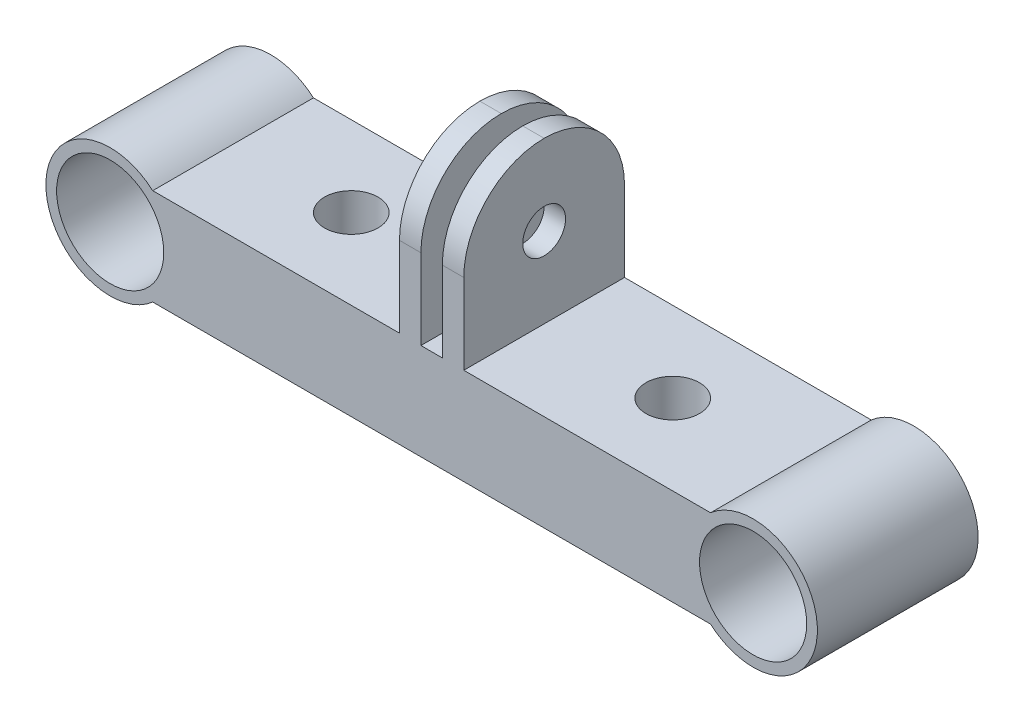
ISO-10303-21;
HEADER;
FILE_DESCRIPTION(('STEP AP214'),'2;1');
FILE_NAME('part.step','',(''),(''),'','','');
FILE_SCHEMA(('AUTOMOTIVE_DESIGN { 1 0 10303 214 1 1 1 1 }'));
ENDSEC;
DATA;
#1=APPLICATION_CONTEXT('core data for automotive mechanical design processes');
#2=APPLICATION_PROTOCOL_DEFINITION('international standard','automotive_design',2000,#1);
#3=PRODUCT_CONTEXT('',#1,'mechanical');
#4=PRODUCT('Part','Part','',(#3));
#5=PRODUCT_RELATED_PRODUCT_CATEGORY('part','',(#4));
#6=PRODUCT_DEFINITION_FORMATION('','',#4);
#7=PRODUCT_DEFINITION_CONTEXT('part definition',#1,'design');
#8=PRODUCT_DEFINITION('design','',#6,#7);
#9=PRODUCT_DEFINITION_SHAPE('','',#8);
#10=(LENGTH_UNIT() NAMED_UNIT(*) SI_UNIT(.MILLI.,.METRE.));
#11=(NAMED_UNIT(*) PLANE_ANGLE_UNIT() SI_UNIT($,.RADIAN.));
#12=(NAMED_UNIT(*) SI_UNIT($,.STERADIAN.) SOLID_ANGLE_UNIT());
#13=UNCERTAINTY_MEASURE_WITH_UNIT(LENGTH_MEASURE(1.E-05),#10,'distance_accuracy_value','');
#14=(GEOMETRIC_REPRESENTATION_CONTEXT(3) GLOBAL_UNCERTAINTY_ASSIGNED_CONTEXT((#13)) GLOBAL_UNIT_ASSIGNED_CONTEXT((#10,
#11,#12)) REPRESENTATION_CONTEXT('',''));
#15=CARTESIAN_POINT('',(0.,0.,0.));
#16=DIRECTION('',(0.,0.,1.));
#17=DIRECTION('',(1.,0.,0.));
#18=AXIS2_PLACEMENT_3D('',#15,#16,#17);
#19=CARTESIAN_POINT('',(-26.0313730334031,-4.5,7.5));
#20=DIRECTION('',(0.,1.,0.));
#21=DIRECTION('',(0.,0.,1.));
#22=AXIS2_PLACEMENT_3D('',#19,#20,#21);
#23=PLANE('',#22);
#24=DIRECTION('',(1.,0.,0.));
#25=VECTOR('',#24,1.);
#26=CARTESIAN_POINT('',(-26.0313730334031,-4.5,-7.5));
#27=LINE('',#26,#25);
#28=CARTESIAN_POINT('',(-26.0313730334031,-4.5,-7.5));
#29=VERTEX_POINT('',#28);
#30=CARTESIAN_POINT('',(26.0313730334031,-4.5,-7.5));
#31=VERTEX_POINT('',#30);
#32=EDGE_CURVE('E223',#29,#31,#27,.T.);
#33=ORIENTED_EDGE('',*,*,#32,.T.);
#34=DIRECTION('',(0.,0.,-1.));
#35=VECTOR('',#34,1.);
#36=CARTESIAN_POINT('',(26.0313730334031,-4.5,7.5));
#37=LINE('',#36,#35);
#38=CARTESIAN_POINT('',(26.0313730334031,-4.5,7.5));
#39=VERTEX_POINT('',#38);
#40=EDGE_CURVE('E235',#39,#31,#37,.T.);
#41=ORIENTED_EDGE('',*,*,#40,.F.);
#42=DIRECTION('',(1.,0.,0.));
#43=VECTOR('',#42,1.);
#44=CARTESIAN_POINT('',(-26.0313730334031,-4.5,7.5));
#45=LINE('',#44,#43);
#46=CARTESIAN_POINT('',(-26.0313730334031,-4.5,7.5));
#47=VERTEX_POINT('',#46);
#48=EDGE_CURVE('E211',#47,#39,#45,.T.);
#49=ORIENTED_EDGE('',*,*,#48,.F.);
#50=DIRECTION('',(0.,0.,-1.));
#51=VECTOR('',#50,1.);
#52=CARTESIAN_POINT('',(-26.0313730334031,-4.5,7.5));
#53=LINE('',#52,#51);
#54=EDGE_CURVE('E238',#47,#29,#53,.T.);
#55=ORIENTED_EDGE('',*,*,#54,.T.);
#56=EDGE_LOOP('',(#33,#41,#49,#55));
#57=FACE_BOUND('',#56,.T.);
#58=CARTESIAN_POINT('',(15.,-4.5,0.));
#59=DIRECTION('',(0.,1.,0.));
#60=DIRECTION('',(0.,0.,1.));
#61=AXIS2_PLACEMENT_3D('',#58,#59,#60);
#62=CIRCLE('',#61,2.5);
#63=CARTESIAN_POINT('',(15.,-4.5,2.5));
#64=VERTEX_POINT('',#63);
#65=EDGE_CURVE('E270',#64,#64,#62,.F.);
#66=ORIENTED_EDGE('',*,*,#65,.F.);
#67=EDGE_LOOP('',(#66));
#68=FACE_BOUND('',#67,.T.);
#69=CARTESIAN_POINT('',(-15.,-4.5,0.));
#70=DIRECTION('',(0.,1.,0.));
#71=DIRECTION('',(0.,0.,1.));
#72=AXIS2_PLACEMENT_3D('',#69,#70,#71);
#73=CIRCLE('',#72,2.5);
#74=CARTESIAN_POINT('',(-15.,-4.5,2.5));
#75=VERTEX_POINT('',#74);
#76=EDGE_CURVE('E41',#75,#75,#73,.T.);
#77=ORIENTED_EDGE('',*,*,#76,.T.);
#78=EDGE_LOOP('',(#77));
#79=FACE_BOUND('',#78,.T.);
#80=ADVANCED_FACE('F37',(#57,#68,#79),#23,.F.);
#81=CARTESIAN_POINT('',(-30.,12.,0.));
#82=DIRECTION('',(-1.,0.,0.));
#83=DIRECTION('',(0.,0.,1.));
#84=AXIS2_PLACEMENT_3D('',#81,#82,#83);
#85=CYLINDRICAL_SURFACE('',#84,7.5);
#86=CARTESIAN_POINT('',(1.,12.,0.));
#87=DIRECTION('',(1.,0.,0.));
#88=DIRECTION('',(0.,0.,-1.));
#89=AXIS2_PLACEMENT_3D('',#86,#87,#88);
#90=CIRCLE('',#89,7.5);
#91=CARTESIAN_POINT('',(1.,12.,7.5));
#92=VERTEX_POINT('',#91);
#93=CARTESIAN_POINT('',(1.,19.5,0.));
#94=VERTEX_POINT('',#93);
#95=EDGE_CURVE('E176',#92,#94,#90,.F.);
#96=ORIENTED_EDGE('',*,*,#95,.F.);
#97=DIRECTION('',(-1.,0.,0.));
#98=VECTOR('',#97,1.);
#99=CARTESIAN_POINT('',(-30.,12.,7.5));
#100=LINE('',#99,#98);
#101=CARTESIAN_POINT('',(3.,12.,7.5));
#102=VERTEX_POINT('',#101);
#103=EDGE_CURVE('E252',#102,#92,#100,.T.);
#104=ORIENTED_EDGE('',*,*,#103,.F.);
#105=CARTESIAN_POINT('',(3.,12.,0.));
#106=DIRECTION('',(1.,0.,0.));
#107=DIRECTION('',(0.,0.,-1.));
#108=AXIS2_PLACEMENT_3D('',#105,#106,#107);
#109=CIRCLE('',#108,7.5);
#110=CARTESIAN_POINT('',(3.,19.5,0.));
#111=VERTEX_POINT('',#110);
#112=EDGE_CURVE('E247',#111,#102,#109,.T.);
#113=ORIENTED_EDGE('',*,*,#112,.F.);
#114=DIRECTION('',(-1.,0.,0.));
#115=VECTOR('',#114,1.);
#116=CARTESIAN_POINT('',(-3.,19.5,0.));
#117=LINE('',#116,#115);
#118=EDGE_CURVE('E62',#94,#111,#117,.F.);
#119=ORIENTED_EDGE('',*,*,#118,.F.);
#120=EDGE_LOOP('',(#96,#104,#113,#119));
#121=FACE_BOUND('',#120,.T.);
#122=ADVANCED_FACE('F336',(#121),#85,.T.);
#123=CARTESIAN_POINT('',(-3.,12.,0.));
#124=DIRECTION('',(1.,0.,0.));
#125=DIRECTION('',(0.,0.,-1.));
#126=AXIS2_PLACEMENT_3D('',#123,#124,#125);
#127=CYLINDRICAL_SURFACE('',#126,7.5);
#128=CARTESIAN_POINT('',(1.,12.,0.));
#129=DIRECTION('',(1.,0.,0.));
#130=DIRECTION('',(0.,0.,-1.));
#131=AXIS2_PLACEMENT_3D('',#128,#129,#130);
#132=CIRCLE('',#131,7.5);
#133=CARTESIAN_POINT('',(1.,12.,-7.5));
#134=VERTEX_POINT('',#133);
#135=EDGE_CURVE('E11',#94,#134,#132,.F.);
#136=ORIENTED_EDGE('',*,*,#135,.F.);
#137=ORIENTED_EDGE('',*,*,#118,.T.);
#138=CARTESIAN_POINT('',(3.,12.,0.));
#139=DIRECTION('',(1.,0.,0.));
#140=DIRECTION('',(0.,0.,-1.));
#141=AXIS2_PLACEMENT_3D('',#138,#139,#140);
#142=CIRCLE('',#141,7.5);
#143=CARTESIAN_POINT('',(3.,12.,-7.5));
#144=VERTEX_POINT('',#143);
#145=EDGE_CURVE('E249',#144,#111,#142,.T.);
#146=ORIENTED_EDGE('',*,*,#145,.F.);
#147=DIRECTION('',(-1.,0.,0.));
#148=VECTOR('',#147,1.);
#149=CARTESIAN_POINT('',(3.,12.,-7.5));
#150=LINE('',#149,#148);
#151=EDGE_CURVE('E245',#134,#144,#150,.F.);
#152=ORIENTED_EDGE('',*,*,#151,.F.);
#153=EDGE_LOOP('',(#136,#137,#146,#152));
#154=FACE_BOUND('',#153,.T.);
#155=ADVANCED_FACE('F341',(#154),#127,.T.);
#156=CARTESIAN_POINT('',(-26.0313730334031,4.5,7.5));
#157=DIRECTION('',(0.,-1.,0.));
#158=DIRECTION('',(0.,0.,-1.));
#159=AXIS2_PLACEMENT_3D('',#156,#157,#158);
#160=PLANE('',#159);
#161=CARTESIAN_POINT('',(-15.,4.5,0.));
#162=DIRECTION('',(0.,1.,0.));
#163=DIRECTION('',(0.,0.,1.));
#164=AXIS2_PLACEMENT_3D('',#161,#162,#163);
#165=CIRCLE('',#164,2.5);
#166=CARTESIAN_POINT('',(-15.,4.5,2.5));
#167=VERTEX_POINT('',#166);
#168=EDGE_CURVE('E380',#167,#167,#165,.T.);
#169=ORIENTED_EDGE('',*,*,#168,.F.);
#170=EDGE_LOOP('',(#169));
#171=FACE_BOUND('',#170,.T.);
#172=DIRECTION('',(-1.,0.,0.));
#173=VECTOR('',#172,1.);
#174=CARTESIAN_POINT('',(-26.0313730334031,4.5,7.5));
#175=LINE('',#174,#173);
#176=CARTESIAN_POINT('',(-3.00000000000001,4.5,7.5));
#177=VERTEX_POINT('',#176);
#178=CARTESIAN_POINT('',(-26.0313730334031,4.5,7.5));
#179=VERTEX_POINT('',#178);
#180=EDGE_CURVE('E216',#177,#179,#175,.T.);
#181=ORIENTED_EDGE('',*,*,#180,.F.);
#182=DIRECTION('',(0.,0.,1.));
#183=VECTOR('',#182,1.);
#184=CARTESIAN_POINT('',(-3.,4.5,-7.5));
#185=LINE('',#184,#183);
#186=CARTESIAN_POINT('',(-3.,4.5,-7.5));
#187=VERTEX_POINT('',#186);
#188=EDGE_CURVE('E190',#187,#177,#185,.T.);
#189=ORIENTED_EDGE('',*,*,#188,.F.);
#190=DIRECTION('',(-1.,0.,0.));
#191=VECTOR('',#190,1.);
#192=CARTESIAN_POINT('',(-26.0313730334031,4.5,-7.5));
#193=LINE('',#192,#191);
#194=CARTESIAN_POINT('',(-26.0313730334031,4.5,-7.5));
#195=VERTEX_POINT('',#194);
#196=EDGE_CURVE('E227',#187,#195,#193,.T.);
#197=ORIENTED_EDGE('',*,*,#196,.T.);
#198=DIRECTION('',(0.,0.,-1.));
#199=VECTOR('',#198,1.);
#200=CARTESIAN_POINT('',(-26.0313730334031,4.5,7.5));
#201=LINE('',#200,#199);
#202=EDGE_CURVE('E220',#179,#195,#201,.T.);
#203=ORIENTED_EDGE('',*,*,#202,.F.);
#204=EDGE_LOOP('',(#181,#189,#197,#203));
#205=FACE_BOUND('',#204,.T.);
#206=ADVANCED_FACE('F308',(#171,#205),#160,.F.);
#207=CARTESIAN_POINT('',(-30.,0.,7.5));
#208=DIRECTION('',(0.,0.,1.));
#209=DIRECTION('',(1.,0.,0.));
#210=AXIS2_PLACEMENT_3D('',#207,#208,#209);
#211=PLANE('',#210);
#212=DIRECTION('',(0.,1.,0.));
#213=VECTOR('',#212,1.);
#214=CARTESIAN_POINT('',(1.,4.5,7.5));
#215=LINE('',#214,#213);
#216=CARTESIAN_POINT('',(1.,4.5,7.5));
#217=VERTEX_POINT('',#216);
#218=EDGE_CURVE('E168',#217,#92,#215,.T.);
#219=ORIENTED_EDGE('',*,*,#218,.F.);
#220=DIRECTION('',(1.,0.,0.));
#221=VECTOR('',#220,1.);
#222=CARTESIAN_POINT('',(1.,4.5,7.5));
#223=LINE('',#222,#221);
#224=CARTESIAN_POINT('',(-1.,4.5,7.5));
#225=VERTEX_POINT('',#224);
#226=EDGE_CURVE('E164',#225,#217,#223,.T.);
#227=ORIENTED_EDGE('',*,*,#226,.F.);
#228=DIRECTION('',(0.,-1.,0.));
#229=VECTOR('',#228,1.);
#230=CARTESIAN_POINT('',(-1.,4.5,7.5));
#231=LINE('',#230,#229);
#232=CARTESIAN_POINT('',(-1.,12.,7.5));
#233=VERTEX_POINT('',#232);
#234=EDGE_CURVE('E143',#233,#225,#231,.T.);
#235=ORIENTED_EDGE('',*,*,#234,.F.);
#236=CARTESIAN_POINT('',(-3.,12.,7.5));
#237=VERTEX_POINT('',#236);
#238=EDGE_CURVE('E251',#233,#237,#100,.T.);
#239=ORIENTED_EDGE('',*,*,#238,.T.);
#240=DIRECTION('',(0.,-1.,0.));
#241=VECTOR('',#240,1.);
#242=CARTESIAN_POINT('',(-3.,4.5,7.5));
#243=LINE('',#242,#241);
#244=EDGE_CURVE('E182',#237,#177,#243,.T.);
#245=ORIENTED_EDGE('',*,*,#244,.T.);
#246=ORIENTED_EDGE('',*,*,#180,.T.);
#247=CARTESIAN_POINT('',(-30.,0.,7.5));
#248=DIRECTION('',(0.,0.,1.));
#249=DIRECTION('',(1.,0.,0.));
#250=AXIS2_PLACEMENT_3D('',#247,#248,#249);
#251=CIRCLE('',#250,6.);
#252=EDGE_CURVE('E208',#179,#47,#251,.T.);
#253=ORIENTED_EDGE('',*,*,#252,.T.);
#254=ORIENTED_EDGE('',*,*,#48,.T.);
#255=CARTESIAN_POINT('',(30.,0.,7.5));
#256=DIRECTION('',(0.,0.,1.));
#257=DIRECTION('',(1.,0.,0.));
#258=AXIS2_PLACEMENT_3D('',#255,#256,#257);
#259=CIRCLE('',#258,6.);
#260=CARTESIAN_POINT('',(26.0313730334031,4.5,7.5));
#261=VERTEX_POINT('',#260);
#262=EDGE_CURVE('E214',#39,#261,#259,.T.);
#263=ORIENTED_EDGE('',*,*,#262,.T.);
#264=CARTESIAN_POINT('',(3.,4.5,7.5));
#265=VERTEX_POINT('',#264);
#266=EDGE_CURVE('E217',#261,#265,#175,.T.);
#267=ORIENTED_EDGE('',*,*,#266,.T.);
#268=DIRECTION('',(0.,1.,0.));
#269=VECTOR('',#268,1.);
#270=CARTESIAN_POINT('',(3.,19.5,7.5));
#271=LINE('',#270,#269);
#272=EDGE_CURVE('E185',#265,#102,#271,.T.);
#273=ORIENTED_EDGE('',*,*,#272,.T.);
#274=ORIENTED_EDGE('',*,*,#103,.T.);
#275=EDGE_LOOP('',(#219,#227,#235,#239,#245,#246,#253,#254,#263,#267,#273,#274));
#276=FACE_BOUND('',#275,.T.);
#277=CARTESIAN_POINT('',(-30.,0.,7.5));
#278=DIRECTION('',(0.,0.,1.));
#279=DIRECTION('',(1.,0.,0.));
#280=AXIS2_PLACEMENT_3D('',#277,#278,#279);
#281=CIRCLE('',#280,5.);
#282=CARTESIAN_POINT('',(-25.,0.,7.5));
#283=VERTEX_POINT('',#282);
#284=EDGE_CURVE('E202',#283,#283,#281,.T.);
#285=ORIENTED_EDGE('',*,*,#284,.F.);
#286=EDGE_LOOP('',(#285));
#287=FACE_BOUND('',#286,.T.);
#288=CARTESIAN_POINT('',(30.,0.,7.5));
#289=DIRECTION('',(0.,0.,1.));
#290=DIRECTION('',(1.,0.,0.));
#291=AXIS2_PLACEMENT_3D('',#288,#289,#290);
#292=CIRCLE('',#291,5.);
#293=CARTESIAN_POINT('',(35.,0.,7.5));
#294=VERTEX_POINT('',#293);
#295=EDGE_CURVE('E196',#294,#294,#292,.T.);
#296=ORIENTED_EDGE('',*,*,#295,.F.);
#297=EDGE_LOOP('',(#296));
#298=FACE_BOUND('',#297,.T.);
#299=ADVANCED_FACE('F322',(#276,#287,#298),#211,.T.);
#300=CARTESIAN_POINT('',(-30.,0.,-7.5));
#301=DIRECTION('',(0.,0.,1.));
#302=DIRECTION('',(1.,0.,0.));
#303=AXIS2_PLACEMENT_3D('',#300,#301,#302);
#304=PLANE('',#303);
#305=DIRECTION('',(1.,0.,0.));
#306=VECTOR('',#305,1.);
#307=CARTESIAN_POINT('',(1.,4.5,-7.5));
#308=LINE('',#307,#306);
#309=CARTESIAN_POINT('',(-1.,4.5,-7.5));
#310=VERTEX_POINT('',#309);
#311=CARTESIAN_POINT('',(1.,4.5,-7.5));
#312=VERTEX_POINT('',#311);
#313=EDGE_CURVE('E148',#310,#312,#308,.T.);
#314=ORIENTED_EDGE('',*,*,#313,.T.);
#315=DIRECTION('',(0.,1.,0.));
#316=VECTOR('',#315,1.);
#317=CARTESIAN_POINT('',(1.,4.5,-7.5));
#318=LINE('',#317,#316);
#319=EDGE_CURVE('E162',#312,#134,#318,.T.);
#320=ORIENTED_EDGE('',*,*,#319,.T.);
#321=ORIENTED_EDGE('',*,*,#151,.T.);
#322=DIRECTION('',(0.,1.,0.));
#323=VECTOR('',#322,1.);
#324=CARTESIAN_POINT('',(3.,19.5,-7.5));
#325=LINE('',#324,#323);
#326=CARTESIAN_POINT('',(3.,4.5,-7.5));
#327=VERTEX_POINT('',#326);
#328=EDGE_CURVE('E178',#327,#144,#325,.T.);
#329=ORIENTED_EDGE('',*,*,#328,.F.);
#330=CARTESIAN_POINT('',(26.0313730334031,4.5,-7.5));
#331=VERTEX_POINT('',#330);
#332=EDGE_CURVE('E212',#331,#327,#193,.T.);
#333=ORIENTED_EDGE('',*,*,#332,.F.);
#334=CARTESIAN_POINT('',(30.,0.,-7.5));
#335=DIRECTION('',(0.,0.,1.));
#336=DIRECTION('',(1.,0.,0.));
#337=AXIS2_PLACEMENT_3D('',#334,#335,#336);
#338=CIRCLE('',#337,6.);
#339=EDGE_CURVE('E225',#31,#331,#338,.T.);
#340=ORIENTED_EDGE('',*,*,#339,.F.);
#341=ORIENTED_EDGE('',*,*,#32,.F.);
#342=CARTESIAN_POINT('',(-30.,0.,-7.5));
#343=DIRECTION('',(0.,0.,1.));
#344=DIRECTION('',(1.,0.,0.));
#345=AXIS2_PLACEMENT_3D('',#342,#343,#344);
#346=CIRCLE('',#345,6.);
#347=EDGE_CURVE('E205',#195,#29,#346,.T.);
#348=ORIENTED_EDGE('',*,*,#347,.F.);
#349=ORIENTED_EDGE('',*,*,#196,.F.);
#350=DIRECTION('',(0.,-1.,0.));
#351=VECTOR('',#350,1.);
#352=CARTESIAN_POINT('',(-3.,4.5,-7.5));
#353=LINE('',#352,#351);
#354=CARTESIAN_POINT('',(-3.,12.,-7.5));
#355=VERTEX_POINT('',#354);
#356=EDGE_CURVE('E181',#355,#187,#353,.T.);
#357=ORIENTED_EDGE('',*,*,#356,.F.);
#358=CARTESIAN_POINT('',(-1.,12.,-7.5));
#359=VERTEX_POINT('',#358);
#360=EDGE_CURVE('E161',#355,#359,#150,.F.);
#361=ORIENTED_EDGE('',*,*,#360,.T.);
#362=DIRECTION('',(0.,-1.,0.));
#363=VECTOR('',#362,1.);
#364=CARTESIAN_POINT('',(-1.,4.5,-7.5));
#365=LINE('',#364,#363);
#366=EDGE_CURVE('E54',#359,#310,#365,.T.);
#367=ORIENTED_EDGE('',*,*,#366,.T.);
#368=EDGE_LOOP('',(#314,#320,#321,#329,#333,#340,#341,#348,#349,#357,#361,#367));
#369=FACE_BOUND('',#368,.T.);
#370=CARTESIAN_POINT('',(-30.,0.,-7.5));
#371=DIRECTION('',(0.,0.,1.));
#372=DIRECTION('',(1.,0.,0.));
#373=AXIS2_PLACEMENT_3D('',#370,#371,#372);
#374=CIRCLE('',#373,5.);
#375=CARTESIAN_POINT('',(-25.,0.,-7.5));
#376=VERTEX_POINT('',#375);
#377=EDGE_CURVE('E199',#376,#376,#374,.T.);
#378=ORIENTED_EDGE('',*,*,#377,.T.);
#379=EDGE_LOOP('',(#378));
#380=FACE_BOUND('',#379,.T.);
#381=CARTESIAN_POINT('',(30.,0.,-7.5));
#382=DIRECTION('',(0.,0.,1.));
#383=DIRECTION('',(1.,0.,0.));
#384=AXIS2_PLACEMENT_3D('',#381,#382,#383);
#385=CIRCLE('',#384,5.);
#386=CARTESIAN_POINT('',(35.,0.,-7.5));
#387=VERTEX_POINT('',#386);
#388=EDGE_CURVE('E193',#387,#387,#385,.T.);
#389=ORIENTED_EDGE('',*,*,#388,.T.);
#390=EDGE_LOOP('',(#389));
#391=FACE_BOUND('',#390,.T.);
#392=ADVANCED_FACE('F157',(#369,#380,#391),#304,.F.);
#393=CARTESIAN_POINT('',(-30.,0.,7.5));
#394=DIRECTION('',(0.,0.,-1.));
#395=DIRECTION('',(-1.,0.,0.));
#396=AXIS2_PLACEMENT_3D('',#393,#394,#395);
#397=CYLINDRICAL_SURFACE('',#396,6.);
#398=ORIENTED_EDGE('',*,*,#347,.T.);
#399=ORIENTED_EDGE('',*,*,#54,.F.);
#400=ORIENTED_EDGE('',*,*,#252,.F.);
#401=ORIENTED_EDGE('',*,*,#202,.T.);
#402=EDGE_LOOP('',(#398,#399,#400,#401));
#403=FACE_BOUND('',#402,.T.);
#404=ADVANCED_FACE('F304',(#403),#397,.T.);
#405=CARTESIAN_POINT('',(30.,0.,7.5));
#406=DIRECTION('',(0.,0.,-1.));
#407=DIRECTION('',(-1.,0.,0.));
#408=AXIS2_PLACEMENT_3D('',#405,#406,#407);
#409=CYLINDRICAL_SURFACE('',#408,6.);
#410=ORIENTED_EDGE('',*,*,#339,.T.);
#411=DIRECTION('',(0.,0.,-1.));
#412=VECTOR('',#411,1.);
#413=CARTESIAN_POINT('',(26.0313730334031,4.5,7.5));
#414=LINE('',#413,#412);
#415=EDGE_CURVE('E232',#261,#331,#414,.T.);
#416=ORIENTED_EDGE('',*,*,#415,.F.);
#417=ORIENTED_EDGE('',*,*,#262,.F.);
#418=ORIENTED_EDGE('',*,*,#40,.T.);
#419=EDGE_LOOP('',(#410,#416,#417,#418));
#420=FACE_BOUND('',#419,.T.);
#421=ADVANCED_FACE('F295',(#420),#409,.T.);
#422=CARTESIAN_POINT('',(15.,4.5,0.));
#423=DIRECTION('',(0.,-1.,0.));
#424=DIRECTION('',(0.,0.,-1.));
#425=AXIS2_PLACEMENT_3D('',#422,#423,#424);
#426=CIRCLE('',#425,2.5);
#427=CARTESIAN_POINT('',(15.,4.5,-2.5));
#428=VERTEX_POINT('',#427);
#429=EDGE_CURVE('E378',#428,#428,#426,.T.);
#430=ORIENTED_EDGE('',*,*,#429,.T.);
#431=EDGE_LOOP('',(#430));
#432=FACE_BOUND('',#431,.T.);
#433=ORIENTED_EDGE('',*,*,#332,.T.);
#434=DIRECTION('',(0.,0.,1.));
#435=VECTOR('',#434,1.);
#436=CARTESIAN_POINT('',(3.,4.5,-7.5));
#437=LINE('',#436,#435);
#438=EDGE_CURVE('E184',#327,#265,#437,.T.);
#439=ORIENTED_EDGE('',*,*,#438,.T.);
#440=ORIENTED_EDGE('',*,*,#266,.F.);
#441=ORIENTED_EDGE('',*,*,#415,.T.);
#442=EDGE_LOOP('',(#433,#439,#440,#441));
#443=FACE_BOUND('',#442,.T.);
#444=ADVANCED_FACE('F290',(#432,#443),#160,.F.);
#445=CARTESIAN_POINT('',(-30.,0.,7.5));
#446=DIRECTION('',(0.,0.,-1.));
#447=DIRECTION('',(-1.,0.,0.));
#448=AXIS2_PLACEMENT_3D('',#445,#446,#447);
#449=CYLINDRICAL_SURFACE('',#448,5.);
#450=ORIENTED_EDGE('',*,*,#284,.T.);
#451=EDGE_LOOP('',(#450));
#452=FACE_BOUND('',#451,.T.);
#453=ORIENTED_EDGE('',*,*,#377,.F.);
#454=EDGE_LOOP('',(#453));
#455=FACE_BOUND('',#454,.T.);
#456=ADVANCED_FACE('F331',(#452,#455),#449,.F.);
#457=CARTESIAN_POINT('',(30.,0.,7.5));
#458=DIRECTION('',(0.,0.,-1.));
#459=DIRECTION('',(-1.,0.,0.));
#460=AXIS2_PLACEMENT_3D('',#457,#458,#459);
#461=CYLINDRICAL_SURFACE('',#460,5.);
#462=ORIENTED_EDGE('',*,*,#295,.T.);
#463=EDGE_LOOP('',(#462));
#464=FACE_BOUND('',#463,.T.);
#465=ORIENTED_EDGE('',*,*,#388,.F.);
#466=EDGE_LOOP('',(#465));
#467=FACE_BOUND('',#466,.T.);
#468=ADVANCED_FACE('F325',(#464,#467),#461,.F.);
#469=CARTESIAN_POINT('',(-3.,4.5,-7.5));
#470=DIRECTION('',(-1.,0.,0.));
#471=DIRECTION('',(0.,0.,1.));
#472=AXIS2_PLACEMENT_3D('',#469,#470,#471);
#473=PLANE('',#472);
#474=CARTESIAN_POINT('',(-3.,12.,0.));
#475=DIRECTION('',(-1.,0.,0.));
#476=DIRECTION('',(0.,-1.,0.));
#477=AXIS2_PLACEMENT_3D('',#474,#475,#476);
#478=CIRCLE('',#477,2.);
#479=CARTESIAN_POINT('',(-3.,10.,0.));
#480=VERTEX_POINT('',#479);
#481=EDGE_CURVE('E260',#480,#480,#478,.T.);
#482=ORIENTED_EDGE('',*,*,#481,.F.);
#483=EDGE_LOOP('',(#482));
#484=FACE_BOUND('',#483,.T.);
#485=CARTESIAN_POINT('',(-3.,12.,0.));
#486=DIRECTION('',(-1.,0.,0.));
#487=DIRECTION('',(0.,0.,1.));
#488=AXIS2_PLACEMENT_3D('',#485,#486,#487);
#489=CIRCLE('',#488,7.5);
#490=CARTESIAN_POINT('',(-3.,19.5,0.));
#491=VERTEX_POINT('',#490);
#492=EDGE_CURVE('E241',#237,#491,#489,.T.);
#493=ORIENTED_EDGE('',*,*,#492,.T.);
#494=CARTESIAN_POINT('',(-3.,12.,0.));
#495=DIRECTION('',(-1.,0.,0.));
#496=DIRECTION('',(0.,0.,1.));
#497=AXIS2_PLACEMENT_3D('',#494,#495,#496);
#498=CIRCLE('',#497,7.5);
#499=EDGE_CURVE('E243',#491,#355,#498,.T.);
#500=ORIENTED_EDGE('',*,*,#499,.T.);
#501=ORIENTED_EDGE('',*,*,#356,.T.);
#502=ORIENTED_EDGE('',*,*,#188,.T.);
#503=ORIENTED_EDGE('',*,*,#244,.F.);
#504=EDGE_LOOP('',(#493,#500,#501,#502,#503));
#505=FACE_BOUND('',#504,.T.);
#506=ADVANCED_FACE('F282',(#484,#505),#473,.T.);
#507=CARTESIAN_POINT('',(3.,19.5,-7.5));
#508=DIRECTION('',(1.,0.,0.));
#509=DIRECTION('',(0.,0.,-1.));
#510=AXIS2_PLACEMENT_3D('',#507,#508,#509);
#511=PLANE('',#510);
#512=CARTESIAN_POINT('',(3.,12.,0.));
#513=DIRECTION('',(1.,0.,0.));
#514=DIRECTION('',(0.,0.,-1.));
#515=AXIS2_PLACEMENT_3D('',#512,#513,#514);
#516=CIRCLE('',#515,2.);
#517=CARTESIAN_POINT('',(3.,12.,-2.));
#518=VERTEX_POINT('',#517);
#519=EDGE_CURVE('E170',#518,#518,#516,.T.);
#520=ORIENTED_EDGE('',*,*,#519,.F.);
#521=EDGE_LOOP('',(#520));
#522=FACE_BOUND('',#521,.T.);
#523=ORIENTED_EDGE('',*,*,#328,.T.);
#524=ORIENTED_EDGE('',*,*,#145,.T.);
#525=ORIENTED_EDGE('',*,*,#112,.T.);
#526=ORIENTED_EDGE('',*,*,#272,.F.);
#527=ORIENTED_EDGE('',*,*,#438,.F.);
#528=EDGE_LOOP('',(#523,#524,#525,#526,#527));
#529=FACE_BOUND('',#528,.T.);
#530=ADVANCED_FACE('F279',(#522,#529),#511,.T.);
#531=CARTESIAN_POINT('',(-1.,12.,0.));
#532=DIRECTION('',(-1.,0.,0.));
#533=DIRECTION('',(0.,0.,1.));
#534=AXIS2_PLACEMENT_3D('',#531,#532,#533);
#535=CIRCLE('',#534,7.5);
#536=CARTESIAN_POINT('',(-1.,19.5,0.));
#537=VERTEX_POINT('',#536);
#538=EDGE_CURVE('E173',#537,#233,#535,.F.);
#539=ORIENTED_EDGE('',*,*,#538,.F.);
#540=EDGE_CURVE('E188',#491,#537,#117,.F.);
#541=ORIENTED_EDGE('',*,*,#540,.F.);
#542=ORIENTED_EDGE('',*,*,#492,.F.);
#543=ORIENTED_EDGE('',*,*,#238,.F.);
#544=EDGE_LOOP('',(#539,#541,#542,#543));
#545=FACE_BOUND('',#544,.T.);
#546=ADVANCED_FACE('F39',(#545),#85,.T.);
#547=CARTESIAN_POINT('',(-1.,12.,0.));
#548=DIRECTION('',(-1.,0.,0.));
#549=DIRECTION('',(0.,0.,1.));
#550=AXIS2_PLACEMENT_3D('',#547,#548,#549);
#551=CIRCLE('',#550,7.5);
#552=EDGE_CURVE('E46',#359,#537,#551,.F.);
#553=ORIENTED_EDGE('',*,*,#552,.F.);
#554=ORIENTED_EDGE('',*,*,#360,.F.);
#555=ORIENTED_EDGE('',*,*,#499,.F.);
#556=ORIENTED_EDGE('',*,*,#540,.T.);
#557=EDGE_LOOP('',(#553,#554,#555,#556));
#558=FACE_BOUND('',#557,.T.);
#559=ADVANCED_FACE('F313',(#558),#127,.T.);
#560=CARTESIAN_POINT('',(1.,4.5,-7.5));
#561=DIRECTION('',(1.,0.,0.));
#562=DIRECTION('',(0.,0.,-1.));
#563=AXIS2_PLACEMENT_3D('',#560,#561,#562);
#564=PLANE('',#563);
#565=CARTESIAN_POINT('',(1.,12.,0.));
#566=DIRECTION('',(1.,0.,0.));
#567=DIRECTION('',(0.,0.,-1.));
#568=AXIS2_PLACEMENT_3D('',#565,#566,#567);
#569=CIRCLE('',#568,2.);
#570=CARTESIAN_POINT('',(1.,12.,-2.));
#571=VERTEX_POINT('',#570);
#572=EDGE_CURVE('E259',#571,#571,#569,.T.);
#573=ORIENTED_EDGE('',*,*,#572,.T.);
#574=EDGE_LOOP('',(#573));
#575=FACE_BOUND('',#574,.T.);
#576=ORIENTED_EDGE('',*,*,#95,.T.);
#577=ORIENTED_EDGE('',*,*,#135,.T.);
#578=ORIENTED_EDGE('',*,*,#319,.F.);
#579=DIRECTION('',(0.,0.,1.));
#580=VECTOR('',#579,1.);
#581=CARTESIAN_POINT('',(1.,4.5,-7.5));
#582=LINE('',#581,#580);
#583=EDGE_CURVE('E147',#312,#217,#582,.T.);
#584=ORIENTED_EDGE('',*,*,#583,.T.);
#585=ORIENTED_EDGE('',*,*,#218,.T.);
#586=EDGE_LOOP('',(#576,#577,#578,#584,#585));
#587=FACE_BOUND('',#586,.T.);
#588=ADVANCED_FACE('F348',(#575,#587),#564,.F.);
#589=CARTESIAN_POINT('',(1.,4.5,-7.5));
#590=DIRECTION('',(0.,-1.,0.));
#591=DIRECTION('',(0.,0.,-1.));
#592=AXIS2_PLACEMENT_3D('',#589,#590,#591);
#593=PLANE('',#592);
#594=ORIENTED_EDGE('',*,*,#226,.T.);
#595=ORIENTED_EDGE('',*,*,#583,.F.);
#596=ORIENTED_EDGE('',*,*,#313,.F.);
#597=DIRECTION('',(0.,0.,1.));
#598=VECTOR('',#597,1.);
#599=CARTESIAN_POINT('',(-1.,4.5,-7.5));
#600=LINE('',#599,#598);
#601=EDGE_CURVE('E139',#310,#225,#600,.T.);
#602=ORIENTED_EDGE('',*,*,#601,.T.);
#603=EDGE_LOOP('',(#594,#595,#596,#602));
#604=FACE_BOUND('',#603,.T.);
#605=ADVANCED_FACE('F151',(#604),#593,.F.);
#606=CARTESIAN_POINT('',(-1.,4.5,-7.5));
#607=DIRECTION('',(-1.,0.,0.));
#608=DIRECTION('',(0.,0.,1.));
#609=AXIS2_PLACEMENT_3D('',#606,#607,#608);
#610=PLANE('',#609);
#611=CARTESIAN_POINT('',(-1.,12.,0.));
#612=DIRECTION('',(-1.,0.,0.));
#613=DIRECTION('',(0.,0.,1.));
#614=AXIS2_PLACEMENT_3D('',#611,#612,#613);
#615=CIRCLE('',#614,2.);
#616=CARTESIAN_POINT('',(-1.,12.,2.));
#617=VERTEX_POINT('',#616);
#618=EDGE_CURVE('E257',#617,#617,#615,.T.);
#619=ORIENTED_EDGE('',*,*,#618,.T.);
#620=EDGE_LOOP('',(#619));
#621=FACE_BOUND('',#620,.T.);
#622=ORIENTED_EDGE('',*,*,#538,.T.);
#623=ORIENTED_EDGE('',*,*,#234,.T.);
#624=ORIENTED_EDGE('',*,*,#601,.F.);
#625=ORIENTED_EDGE('',*,*,#366,.F.);
#626=ORIENTED_EDGE('',*,*,#552,.T.);
#627=EDGE_LOOP('',(#622,#623,#624,#625,#626));
#628=FACE_BOUND('',#627,.T.);
#629=ADVANCED_FACE('F141',(#621,#628),#610,.F.);
#630=CARTESIAN_POINT('',(12.,12.,0.));
#631=DIRECTION('',(-1.,0.,0.));
#632=DIRECTION('',(0.,-1.,0.));
#633=AXIS2_PLACEMENT_3D('',#630,#631,#632);
#634=CYLINDRICAL_SURFACE('',#633,2.);
#635=ORIENTED_EDGE('',*,*,#481,.T.);
#636=EDGE_LOOP('',(#635));
#637=FACE_BOUND('',#636,.T.);
#638=ORIENTED_EDGE('',*,*,#618,.F.);
#639=EDGE_LOOP('',(#638));
#640=FACE_BOUND('',#639,.T.);
#641=ADVANCED_FACE('F401',(#637,#640),#634,.F.);
#642=ORIENTED_EDGE('',*,*,#519,.T.);
#643=EDGE_LOOP('',(#642));
#644=FACE_BOUND('',#643,.T.);
#645=ORIENTED_EDGE('',*,*,#572,.F.);
#646=EDGE_LOOP('',(#645));
#647=FACE_BOUND('',#646,.T.);
#648=ADVANCED_FACE('F276',(#644,#647),#634,.F.);
#649=CARTESIAN_POINT('',(15.,-6.,0.));
#650=DIRECTION('',(0.,1.,0.));
#651=DIRECTION('',(0.,0.,1.));
#652=AXIS2_PLACEMENT_3D('',#649,#650,#651);
#653=CYLINDRICAL_SURFACE('',#652,2.5);
#654=ORIENTED_EDGE('',*,*,#429,.F.);
#655=EDGE_LOOP('',(#654));
#656=FACE_BOUND('',#655,.T.);
#657=ORIENTED_EDGE('',*,*,#65,.T.);
#658=EDGE_LOOP('',(#657));
#659=FACE_BOUND('',#658,.T.);
#660=ADVANCED_FACE('F387',(#656,#659),#653,.F.);
#661=CARTESIAN_POINT('',(-15.,-6.,0.));
#662=DIRECTION('',(0.,1.,0.));
#663=DIRECTION('',(0.,0.,1.));
#664=AXIS2_PLACEMENT_3D('',#661,#662,#663);
#665=CYLINDRICAL_SURFACE('',#664,2.5);
#666=ORIENTED_EDGE('',*,*,#168,.T.);
#667=EDGE_LOOP('',(#666));
#668=FACE_BOUND('',#667,.T.);
#669=ORIENTED_EDGE('',*,*,#76,.F.);
#670=EDGE_LOOP('',(#669));
#671=FACE_BOUND('',#670,.T.);
#672=ADVANCED_FACE('F391',(#668,#671),#665,.F.);
#673=CLOSED_SHELL('',(#80,#122,#155,#206,#299,#392,#404,#421,#444,#456,#468,#506,#530,#546,#559,
#588,#605,#629,#641,#648,#660,#672));
#674=MANIFOLD_SOLID_BREP('B2',#673);
#675=ADVANCED_BREP_SHAPE_REPRESENTATION('',(#18,#674),#14);
#676=SHAPE_DEFINITION_REPRESENTATION(#9,#675);
ENDSEC;
END-ISO-10303-21;
